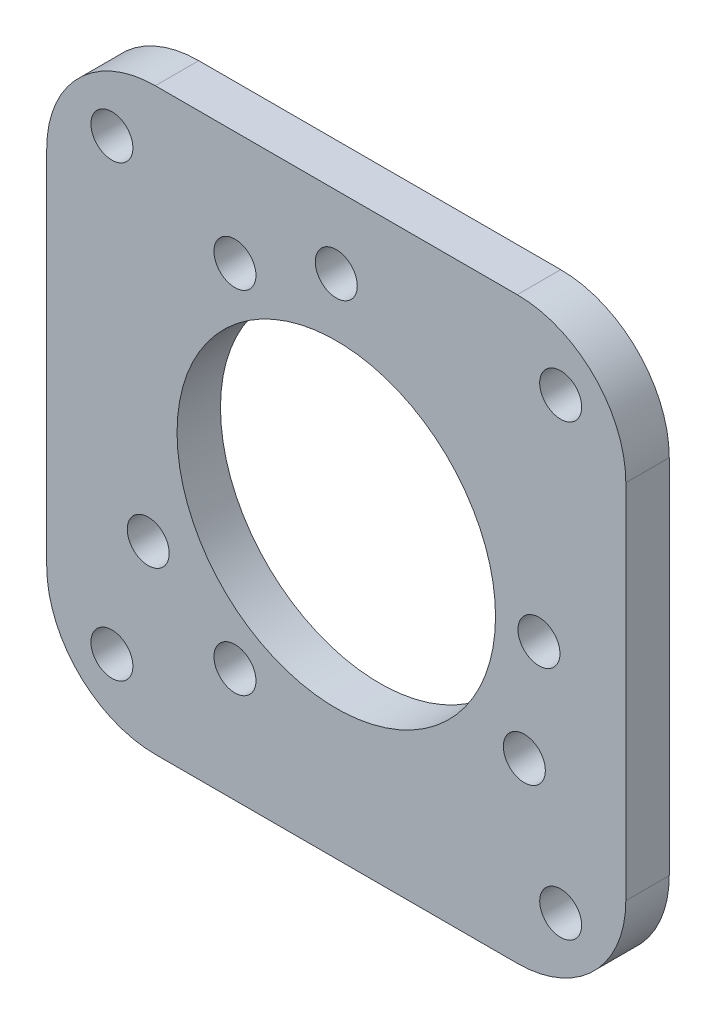
ISO-10303-21;
HEADER;
FILE_DESCRIPTION(('STEP AP214'),'2;1');
FILE_NAME('part.step','',(''),(''),'','','');
FILE_SCHEMA(('AUTOMOTIVE_DESIGN { 1 0 10303 214 1 1 1 1 }'));
ENDSEC;
DATA;
#1=APPLICATION_CONTEXT('core data for automotive mechanical design processes');
#2=APPLICATION_PROTOCOL_DEFINITION('international standard','automotive_design',2000,#1);
#3=PRODUCT_CONTEXT('',#1,'mechanical');
#4=PRODUCT('Part','Part','',(#3));
#5=PRODUCT_RELATED_PRODUCT_CATEGORY('part','',(#4));
#6=PRODUCT_DEFINITION_FORMATION('','',#4);
#7=PRODUCT_DEFINITION_CONTEXT('part definition',#1,'design');
#8=PRODUCT_DEFINITION('design','',#6,#7);
#9=PRODUCT_DEFINITION_SHAPE('','',#8);
#10=(LENGTH_UNIT() NAMED_UNIT(*) SI_UNIT(.MILLI.,.METRE.));
#11=(NAMED_UNIT(*) PLANE_ANGLE_UNIT() SI_UNIT($,.RADIAN.));
#12=(NAMED_UNIT(*) SI_UNIT($,.STERADIAN.) SOLID_ANGLE_UNIT());
#13=UNCERTAINTY_MEASURE_WITH_UNIT(LENGTH_MEASURE(1.E-05),#10,'distance_accuracy_value','');
#14=(GEOMETRIC_REPRESENTATION_CONTEXT(3) GLOBAL_UNCERTAINTY_ASSIGNED_CONTEXT((#13)) GLOBAL_UNIT_ASSIGNED_CONTEXT((#10,
#11,#12)) REPRESENTATION_CONTEXT('',''));
#15=CARTESIAN_POINT('',(0.,0.,0.));
#16=DIRECTION('',(0.,0.,1.));
#17=DIRECTION('',(1.,0.,0.));
#18=AXIS2_PLACEMENT_3D('',#15,#16,#17);
#19=CARTESIAN_POINT('',(12.5,12.5,3.));
#20=DIRECTION('',(0.,0.,-1.));
#21=DIRECTION('',(-1.,0.,0.));
#22=AXIS2_PLACEMENT_3D('',#19,#20,#21);
#23=CYLINDRICAL_SURFACE('',#22,7.49999999999999);
#24=CARTESIAN_POINT('',(12.5,12.5,0.));
#25=DIRECTION('',(0.,0.,1.));
#26=DIRECTION('',(1.,0.,0.));
#27=AXIS2_PLACEMENT_3D('',#24,#25,#26);
#28=CIRCLE('',#27,7.49999999999999);
#29=CARTESIAN_POINT('',(20.,12.5,0.));
#30=VERTEX_POINT('',#29);
#31=CARTESIAN_POINT('',(12.4999999967872,20.,0.));
#32=VERTEX_POINT('',#31);
#33=EDGE_CURVE('E130',#30,#32,#28,.T.);
#34=ORIENTED_EDGE('',*,*,#33,.T.);
#35=DIRECTION('',(0.,0.,-1.));
#36=VECTOR('',#35,1.);
#37=CARTESIAN_POINT('',(12.4999999967872,20.,3.));
#38=LINE('',#37,#36);
#39=CARTESIAN_POINT('',(12.4999999967872,20.,3.));
#40=VERTEX_POINT('',#39);
#41=EDGE_CURVE('E11',#40,#32,#38,.T.);
#42=ORIENTED_EDGE('',*,*,#41,.F.);
#43=CARTESIAN_POINT('',(12.5,12.5,3.));
#44=DIRECTION('',(0.,0.,1.));
#45=DIRECTION('',(1.,0.,0.));
#46=AXIS2_PLACEMENT_3D('',#43,#44,#45);
#47=CIRCLE('',#46,7.49999999999999);
#48=CARTESIAN_POINT('',(20.,12.5,3.));
#49=VERTEX_POINT('',#48);
#50=EDGE_CURVE('E145',#49,#40,#47,.T.);
#51=ORIENTED_EDGE('',*,*,#50,.F.);
#52=DIRECTION('',(0.,0.,-1.));
#53=VECTOR('',#52,1.);
#54=CARTESIAN_POINT('',(20.,12.5,3.));
#55=LINE('',#54,#53);
#56=EDGE_CURVE('E126',#49,#30,#55,.T.);
#57=ORIENTED_EDGE('',*,*,#56,.T.);
#58=EDGE_LOOP('',(#34,#42,#51,#57));
#59=FACE_BOUND('',#58,.T.);
#60=ADVANCED_FACE('F34',(#59),#23,.T.);
#61=CARTESIAN_POINT('',(-12.5000013839522,20.,3.));
#62=DIRECTION('',(0.,-1.,0.));
#63=DIRECTION('',(0.,0.,-1.));
#64=AXIS2_PLACEMENT_3D('',#61,#62,#63);
#65=PLANE('',#64);
#66=DIRECTION('',(-1.,0.,0.));
#67=VECTOR('',#66,1.);
#68=CARTESIAN_POINT('',(-12.5000013839522,20.,0.));
#69=LINE('',#68,#67);
#70=CARTESIAN_POINT('',(-12.5000013839522,20.,0.));
#71=VERTEX_POINT('',#70);
#72=EDGE_CURVE('E133',#32,#71,#69,.T.);
#73=ORIENTED_EDGE('',*,*,#72,.T.);
#74=DIRECTION('',(0.,0.,-1.));
#75=VECTOR('',#74,1.);
#76=CARTESIAN_POINT('',(-12.5000013839522,20.,3.));
#77=LINE('',#76,#75);
#78=CARTESIAN_POINT('',(-12.5000013839522,20.,3.));
#79=VERTEX_POINT('',#78);
#80=EDGE_CURVE('E42',#79,#71,#77,.T.);
#81=ORIENTED_EDGE('',*,*,#80,.F.);
#82=DIRECTION('',(-1.,0.,0.));
#83=VECTOR('',#82,1.);
#84=CARTESIAN_POINT('',(-12.5000013839522,20.,3.));
#85=LINE('',#84,#83);
#86=EDGE_CURVE('E93',#40,#79,#85,.T.);
#87=ORIENTED_EDGE('',*,*,#86,.F.);
#88=ORIENTED_EDGE('',*,*,#41,.T.);
#89=EDGE_LOOP('',(#73,#81,#87,#88));
#90=FACE_BOUND('',#89,.T.);
#91=ADVANCED_FACE('F264',(#90),#65,.F.);
#92=CARTESIAN_POINT('',(-12.5,12.5,3.));
#93=DIRECTION('',(0.,0.,-1.));
#94=DIRECTION('',(-1.,0.,0.));
#95=AXIS2_PLACEMENT_3D('',#92,#93,#94);
#96=CYLINDRICAL_SURFACE('',#95,7.50000000000006);
#97=CARTESIAN_POINT('',(-12.5,12.5,0.));
#98=DIRECTION('',(0.,0.,1.));
#99=DIRECTION('',(1.,0.,0.));
#100=AXIS2_PLACEMENT_3D('',#97,#98,#99);
#101=CIRCLE('',#100,7.50000000000006);
#102=CARTESIAN_POINT('',(-20.0000000000001,12.5,0.));
#103=VERTEX_POINT('',#102);
#104=EDGE_CURVE('E136',#71,#103,#101,.T.);
#105=ORIENTED_EDGE('',*,*,#104,.T.);
#106=DIRECTION('',(0.,0.,-1.));
#107=VECTOR('',#106,1.);
#108=CARTESIAN_POINT('',(-20.0000000000001,12.5,3.));
#109=LINE('',#108,#107);
#110=CARTESIAN_POINT('',(-20.0000000000001,12.5,3.));
#111=VERTEX_POINT('',#110);
#112=EDGE_CURVE('E152',#111,#103,#109,.T.);
#113=ORIENTED_EDGE('',*,*,#112,.F.);
#114=CARTESIAN_POINT('',(-12.5,12.5,3.));
#115=DIRECTION('',(0.,0.,1.));
#116=DIRECTION('',(1.,0.,0.));
#117=AXIS2_PLACEMENT_3D('',#114,#115,#116);
#118=CIRCLE('',#117,7.50000000000006);
#119=EDGE_CURVE('E160',#79,#111,#118,.T.);
#120=ORIENTED_EDGE('',*,*,#119,.F.);
#121=ORIENTED_EDGE('',*,*,#80,.T.);
#122=EDGE_LOOP('',(#105,#113,#120,#121));
#123=FACE_BOUND('',#122,.T.);
#124=ADVANCED_FACE('F158',(#123),#96,.T.);
#125=CARTESIAN_POINT('',(-20.,12.5,3.));
#126=DIRECTION('',(1.,0.,0.));
#127=DIRECTION('',(0.,0.,-1.));
#128=AXIS2_PLACEMENT_3D('',#125,#126,#127);
#129=PLANE('',#128);
#130=DIRECTION('',(0.,-1.,0.));
#131=VECTOR('',#130,1.);
#132=CARTESIAN_POINT('',(-20.,12.5,0.));
#133=LINE('',#132,#131);
#134=CARTESIAN_POINT('',(-20.,-12.5000006178472,0.));
#135=VERTEX_POINT('',#134);
#136=EDGE_CURVE('E138',#103,#135,#133,.T.);
#137=ORIENTED_EDGE('',*,*,#136,.T.);
#138=DIRECTION('',(0.,0.,-1.));
#139=VECTOR('',#138,1.);
#140=CARTESIAN_POINT('',(-20.,-12.5000006178472,3.));
#141=LINE('',#140,#139);
#142=CARTESIAN_POINT('',(-20.,-12.5000006178472,3.));
#143=VERTEX_POINT('',#142);
#144=EDGE_CURVE('E149',#143,#135,#141,.T.);
#145=ORIENTED_EDGE('',*,*,#144,.F.);
#146=DIRECTION('',(0.,-1.,0.));
#147=VECTOR('',#146,1.);
#148=CARTESIAN_POINT('',(-20.,12.5,3.));
#149=LINE('',#148,#147);
#150=EDGE_CURVE('E172',#111,#143,#149,.T.);
#151=ORIENTED_EDGE('',*,*,#150,.F.);
#152=ORIENTED_EDGE('',*,*,#112,.T.);
#153=EDGE_LOOP('',(#137,#145,#151,#152));
#154=FACE_BOUND('',#153,.T.);
#155=ADVANCED_FACE('F168',(#154),#129,.F.);
#156=CARTESIAN_POINT('',(-12.5,-12.5,3.));
#157=DIRECTION('',(0.,0.,-1.));
#158=DIRECTION('',(-1.,0.,0.));
#159=AXIS2_PLACEMENT_3D('',#156,#157,#158);
#160=CYLINDRICAL_SURFACE('',#159,7.50000000000002);
#161=CARTESIAN_POINT('',(-12.5,-12.5,0.));
#162=DIRECTION('',(0.,0.,1.));
#163=DIRECTION('',(1.,0.,0.));
#164=AXIS2_PLACEMENT_3D('',#161,#162,#163);
#165=CIRCLE('',#164,7.50000000000002);
#166=CARTESIAN_POINT('',(-12.5,-20.,0.));
#167=VERTEX_POINT('',#166);
#168=EDGE_CURVE('E140',#135,#167,#165,.T.);
#169=ORIENTED_EDGE('',*,*,#168,.T.);
#170=DIRECTION('',(0.,0.,-1.));
#171=VECTOR('',#170,1.);
#172=CARTESIAN_POINT('',(-12.5,-20.,3.));
#173=LINE('',#172,#171);
#174=CARTESIAN_POINT('',(-12.5,-20.,3.));
#175=VERTEX_POINT('',#174);
#176=EDGE_CURVE('E121',#175,#167,#173,.T.);
#177=ORIENTED_EDGE('',*,*,#176,.F.);
#178=CARTESIAN_POINT('',(-12.5,-12.5,3.));
#179=DIRECTION('',(0.,0.,1.));
#180=DIRECTION('',(1.,0.,0.));
#181=AXIS2_PLACEMENT_3D('',#178,#179,#180);
#182=CIRCLE('',#181,7.50000000000002);
#183=EDGE_CURVE('E112',#143,#175,#182,.T.);
#184=ORIENTED_EDGE('',*,*,#183,.F.);
#185=ORIENTED_EDGE('',*,*,#144,.T.);
#186=EDGE_LOOP('',(#169,#177,#184,#185));
#187=FACE_BOUND('',#186,.T.);
#188=ADVANCED_FACE('F171',(#187),#160,.T.);
#189=CARTESIAN_POINT('',(-12.5,-20.,3.));
#190=DIRECTION('',(0.,1.,0.));
#191=DIRECTION('',(-1.,0.,0.));
#192=AXIS2_PLACEMENT_3D('',#189,#190,#191);
#193=PLANE('',#192);
#194=DIRECTION('',(1.,0.,0.));
#195=VECTOR('',#194,1.);
#196=CARTESIAN_POINT('',(-12.5,-20.,0.));
#197=LINE('',#196,#195);
#198=CARTESIAN_POINT('',(12.5,-20.,0.));
#199=VERTEX_POINT('',#198);
#200=EDGE_CURVE('E120',#167,#199,#197,.T.);
#201=ORIENTED_EDGE('',*,*,#200,.T.);
#202=DIRECTION('',(0.,0.,-1.));
#203=VECTOR('',#202,1.);
#204=CARTESIAN_POINT('',(12.5,-20.,3.));
#205=LINE('',#204,#203);
#206=CARTESIAN_POINT('',(12.5,-20.,3.));
#207=VERTEX_POINT('',#206);
#208=EDGE_CURVE('E117',#207,#199,#205,.T.);
#209=ORIENTED_EDGE('',*,*,#208,.F.);
#210=DIRECTION('',(1.,0.,0.));
#211=VECTOR('',#210,1.);
#212=CARTESIAN_POINT('',(-12.5,-20.,3.));
#213=LINE('',#212,#211);
#214=EDGE_CURVE('E106',#175,#207,#213,.T.);
#215=ORIENTED_EDGE('',*,*,#214,.F.);
#216=ORIENTED_EDGE('',*,*,#176,.T.);
#217=EDGE_LOOP('',(#201,#209,#215,#216));
#218=FACE_BOUND('',#217,.T.);
#219=ADVANCED_FACE('F118',(#218),#193,.F.);
#220=CARTESIAN_POINT('',(12.5,-12.5,3.));
#221=DIRECTION('',(0.,0.,-1.));
#222=DIRECTION('',(-1.,0.,0.));
#223=AXIS2_PLACEMENT_3D('',#220,#221,#222);
#224=CYLINDRICAL_SURFACE('',#223,7.49999999999999);
#225=CARTESIAN_POINT('',(12.5,-12.5,0.));
#226=DIRECTION('',(0.,0.,1.));
#227=DIRECTION('',(1.,0.,0.));
#228=AXIS2_PLACEMENT_3D('',#225,#226,#227);
#229=CIRCLE('',#228,7.49999999999999);
#230=CARTESIAN_POINT('',(20.,-12.5,0.));
#231=VERTEX_POINT('',#230);
#232=EDGE_CURVE('E79',#199,#231,#229,.T.);
#233=ORIENTED_EDGE('',*,*,#232,.T.);
#234=DIRECTION('',(0.,0.,-1.));
#235=VECTOR('',#234,1.);
#236=CARTESIAN_POINT('',(20.,-12.5,3.));
#237=LINE('',#236,#235);
#238=CARTESIAN_POINT('',(20.,-12.5,3.));
#239=VERTEX_POINT('',#238);
#240=EDGE_CURVE('E122',#239,#231,#237,.T.);
#241=ORIENTED_EDGE('',*,*,#240,.F.);
#242=CARTESIAN_POINT('',(12.5,-12.5,3.));
#243=DIRECTION('',(0.,0.,1.));
#244=DIRECTION('',(1.,0.,0.));
#245=AXIS2_PLACEMENT_3D('',#242,#243,#244);
#246=CIRCLE('',#245,7.49999999999999);
#247=EDGE_CURVE('E110',#207,#239,#246,.T.);
#248=ORIENTED_EDGE('',*,*,#247,.F.);
#249=ORIENTED_EDGE('',*,*,#208,.T.);
#250=EDGE_LOOP('',(#233,#241,#248,#249));
#251=FACE_BOUND('',#250,.T.);
#252=ADVANCED_FACE('F124',(#251),#224,.T.);
#253=CARTESIAN_POINT('',(20.,12.5,3.));
#254=DIRECTION('',(-1.,0.,0.));
#255=DIRECTION('',(0.,0.,1.));
#256=AXIS2_PLACEMENT_3D('',#253,#254,#255);
#257=PLANE('',#256);
#258=DIRECTION('',(0.,1.,0.));
#259=VECTOR('',#258,1.);
#260=CARTESIAN_POINT('',(20.,12.5,0.));
#261=LINE('',#260,#259);
#262=EDGE_CURVE('E85',#231,#30,#261,.T.);
#263=ORIENTED_EDGE('',*,*,#262,.T.);
#264=ORIENTED_EDGE('',*,*,#56,.F.);
#265=DIRECTION('',(0.,1.,0.));
#266=VECTOR('',#265,1.);
#267=CARTESIAN_POINT('',(20.,12.5,3.));
#268=LINE('',#267,#266);
#269=EDGE_CURVE('E50',#239,#49,#268,.T.);
#270=ORIENTED_EDGE('',*,*,#269,.F.);
#271=ORIENTED_EDGE('',*,*,#240,.T.);
#272=EDGE_LOOP('',(#263,#264,#270,#271));
#273=FACE_BOUND('',#272,.T.);
#274=ADVANCED_FACE('F271',(#273),#257,.F.);
#275=CARTESIAN_POINT('',(12.5,12.5,3.));
#276=DIRECTION('',(0.,0.,1.));
#277=DIRECTION('',(1.,0.,0.));
#278=AXIS2_PLACEMENT_3D('',#275,#276,#277);
#279=PLANE('',#278);
#280=CARTESIAN_POINT('',(-7.00000000000001,-12.1243556529821,3.));
#281=DIRECTION('',(0.,0.,1.));
#282=DIRECTION('',(1.,0.,0.));
#283=AXIS2_PLACEMENT_3D('',#280,#281,#282);
#284=CIRCLE('',#283,1.45);
#285=CARTESIAN_POINT('',(-5.55000000000001,-12.1243556529821,3.));
#286=VERTEX_POINT('',#285);
#287=EDGE_CURVE('E183',#286,#286,#284,.F.);
#288=ORIENTED_EDGE('',*,*,#287,.T.);
#289=EDGE_LOOP('',(#288));
#290=FACE_BOUND('',#289,.T.);
#291=CARTESIAN_POINT('',(12.9903810567666,-7.50000000000001,3.));
#292=DIRECTION('',(0.,0.,1.));
#293=DIRECTION('',(1.,0.,0.));
#294=AXIS2_PLACEMENT_3D('',#291,#292,#293);
#295=CIRCLE('',#294,1.45);
#296=CARTESIAN_POINT('',(14.4403810567666,-7.50000000000001,3.));
#297=VERTEX_POINT('',#296);
#298=EDGE_CURVE('E186',#297,#297,#295,.F.);
#299=ORIENTED_EDGE('',*,*,#298,.T.);
#300=EDGE_LOOP('',(#299));
#301=FACE_BOUND('',#300,.T.);
#302=CARTESIAN_POINT('',(0.,0.,3.));
#303=DIRECTION('',(0.,0.,1.));
#304=DIRECTION('',(1.,0.,0.));
#305=AXIS2_PLACEMENT_3D('',#302,#303,#304);
#306=CIRCLE('',#305,11.);
#307=CARTESIAN_POINT('',(11.,0.,3.));
#308=VERTEX_POINT('',#307);
#309=EDGE_CURVE('E189',#308,#308,#306,.F.);
#310=ORIENTED_EDGE('',*,*,#309,.T.);
#311=EDGE_LOOP('',(#310));
#312=FACE_BOUND('',#311,.T.);
#313=CARTESIAN_POINT('',(-12.9903810567666,-7.49999999999992,3.));
#314=DIRECTION('',(0.,0.,1.));
#315=DIRECTION('',(1.,0.,0.));
#316=AXIS2_PLACEMENT_3D('',#313,#314,#315);
#317=CIRCLE('',#316,1.45);
#318=CARTESIAN_POINT('',(-11.5403810567666,-7.49999999999992,3.));
#319=VERTEX_POINT('',#318);
#320=EDGE_CURVE('E192',#319,#319,#317,.F.);
#321=ORIENTED_EDGE('',*,*,#320,.T.);
#322=EDGE_LOOP('',(#321));
#323=FACE_BOUND('',#322,.T.);
#324=CARTESIAN_POINT('',(-7.00000000000002,12.1243556529821,3.));
#325=DIRECTION('',(0.,0.,1.));
#326=DIRECTION('',(1.,0.,0.));
#327=AXIS2_PLACEMENT_3D('',#324,#325,#326);
#328=CIRCLE('',#327,1.45);
#329=CARTESIAN_POINT('',(-5.55000000000002,12.1243556529821,3.));
#330=VERTEX_POINT('',#329);
#331=EDGE_CURVE('E195',#330,#330,#328,.F.);
#332=ORIENTED_EDGE('',*,*,#331,.T.);
#333=EDGE_LOOP('',(#332));
#334=FACE_BOUND('',#333,.T.);
#335=CARTESIAN_POINT('',(-15.5,15.5,3.));
#336=DIRECTION('',(0.,0.,1.));
#337=DIRECTION('',(1.,0.,0.));
#338=AXIS2_PLACEMENT_3D('',#335,#336,#337);
#339=CIRCLE('',#338,1.45);
#340=CARTESIAN_POINT('',(-14.05,15.5,3.));
#341=VERTEX_POINT('',#340);
#342=EDGE_CURVE('E198',#341,#341,#339,.F.);
#343=ORIENTED_EDGE('',*,*,#342,.T.);
#344=EDGE_LOOP('',(#343));
#345=FACE_BOUND('',#344,.T.);
#346=CARTESIAN_POINT('',(15.5,-15.5,3.));
#347=DIRECTION('',(0.,0.,1.));
#348=DIRECTION('',(1.,0.,0.));
#349=AXIS2_PLACEMENT_3D('',#346,#347,#348);
#350=CIRCLE('',#349,1.45);
#351=CARTESIAN_POINT('',(16.95,-15.5,3.));
#352=VERTEX_POINT('',#351);
#353=EDGE_CURVE('E201',#352,#352,#350,.F.);
#354=ORIENTED_EDGE('',*,*,#353,.T.);
#355=EDGE_LOOP('',(#354));
#356=FACE_BOUND('',#355,.T.);
#357=CARTESIAN_POINT('',(-15.5,-15.5,3.));
#358=DIRECTION('',(0.,0.,1.));
#359=DIRECTION('',(1.,0.,0.));
#360=AXIS2_PLACEMENT_3D('',#357,#358,#359);
#361=CIRCLE('',#360,1.45);
#362=CARTESIAN_POINT('',(-14.05,-15.5,3.));
#363=VERTEX_POINT('',#362);
#364=EDGE_CURVE('E204',#363,#363,#361,.F.);
#365=ORIENTED_EDGE('',*,*,#364,.T.);
#366=EDGE_LOOP('',(#365));
#367=FACE_BOUND('',#366,.T.);
#368=CARTESIAN_POINT('',(0.,15.,3.));
#369=DIRECTION('',(0.,0.,1.));
#370=DIRECTION('',(1.,0.,0.));
#371=AXIS2_PLACEMENT_3D('',#368,#369,#370);
#372=CIRCLE('',#371,1.45);
#373=CARTESIAN_POINT('',(1.45,15.,3.));
#374=VERTEX_POINT('',#373);
#375=EDGE_CURVE('E207',#374,#374,#372,.F.);
#376=ORIENTED_EDGE('',*,*,#375,.T.);
#377=EDGE_LOOP('',(#376));
#378=FACE_BOUND('',#377,.T.);
#379=CARTESIAN_POINT('',(14.,0.,3.));
#380=DIRECTION('',(0.,0.,1.));
#381=DIRECTION('',(1.,0.,0.));
#382=AXIS2_PLACEMENT_3D('',#379,#380,#381);
#383=CIRCLE('',#382,1.45);
#384=CARTESIAN_POINT('',(15.45,0.,3.));
#385=VERTEX_POINT('',#384);
#386=EDGE_CURVE('E210',#385,#385,#383,.F.);
#387=ORIENTED_EDGE('',*,*,#386,.T.);
#388=EDGE_LOOP('',(#387));
#389=FACE_BOUND('',#388,.T.);
#390=CARTESIAN_POINT('',(15.5,15.5,3.));
#391=DIRECTION('',(0.,0.,1.));
#392=DIRECTION('',(1.,0.,0.));
#393=AXIS2_PLACEMENT_3D('',#390,#391,#392);
#394=CIRCLE('',#393,1.45);
#395=CARTESIAN_POINT('',(16.95,15.5,3.));
#396=VERTEX_POINT('',#395);
#397=EDGE_CURVE('E134',#396,#396,#394,.F.);
#398=ORIENTED_EDGE('',*,*,#397,.T.);
#399=EDGE_LOOP('',(#398));
#400=FACE_BOUND('',#399,.T.);
#401=ORIENTED_EDGE('',*,*,#50,.T.);
#402=ORIENTED_EDGE('',*,*,#86,.T.);
#403=ORIENTED_EDGE('',*,*,#119,.T.);
#404=ORIENTED_EDGE('',*,*,#150,.T.);
#405=ORIENTED_EDGE('',*,*,#183,.T.);
#406=ORIENTED_EDGE('',*,*,#214,.T.);
#407=ORIENTED_EDGE('',*,*,#247,.T.);
#408=ORIENTED_EDGE('',*,*,#269,.T.);
#409=EDGE_LOOP('',(#401,#402,#403,#404,#405,#406,#407,#408));
#410=FACE_BOUND('',#409,.T.);
#411=ADVANCED_FACE('F108',(#290,#301,#312,#323,#334,#345,#356,#367,#378,#389,#400,#410),#279,.T.);
#412=CARTESIAN_POINT('',(12.5,12.5,0.));
#413=DIRECTION('',(0.,0.,1.));
#414=DIRECTION('',(1.,0.,0.));
#415=AXIS2_PLACEMENT_3D('',#412,#413,#414);
#416=PLANE('',#415);
#417=CARTESIAN_POINT('',(-7.00000000000001,-12.1243556529821,0.));
#418=DIRECTION('',(0.,0.,1.));
#419=DIRECTION('',(1.,0.,0.));
#420=AXIS2_PLACEMENT_3D('',#417,#418,#419);
#421=CIRCLE('',#420,1.45);
#422=CARTESIAN_POINT('',(-5.55000000000001,-12.1243556529821,0.));
#423=VERTEX_POINT('',#422);
#424=EDGE_CURVE('E224',#423,#423,#421,.T.);
#425=ORIENTED_EDGE('',*,*,#424,.T.);
#426=EDGE_LOOP('',(#425));
#427=FACE_BOUND('',#426,.T.);
#428=CARTESIAN_POINT('',(12.9903810567666,-7.50000000000001,0.));
#429=DIRECTION('',(0.,0.,1.));
#430=DIRECTION('',(1.,0.,0.));
#431=AXIS2_PLACEMENT_3D('',#428,#429,#430);
#432=CIRCLE('',#431,1.45);
#433=CARTESIAN_POINT('',(14.4403810567666,-7.50000000000001,0.));
#434=VERTEX_POINT('',#433);
#435=EDGE_CURVE('E229',#434,#434,#432,.T.);
#436=ORIENTED_EDGE('',*,*,#435,.T.);
#437=EDGE_LOOP('',(#436));
#438=FACE_BOUND('',#437,.T.);
#439=CARTESIAN_POINT('',(0.,0.,0.));
#440=DIRECTION('',(0.,0.,1.));
#441=DIRECTION('',(1.,0.,0.));
#442=AXIS2_PLACEMENT_3D('',#439,#440,#441);
#443=CIRCLE('',#442,11.);
#444=CARTESIAN_POINT('',(11.,0.,0.));
#445=VERTEX_POINT('',#444);
#446=EDGE_CURVE('E238',#445,#445,#443,.T.);
#447=ORIENTED_EDGE('',*,*,#446,.T.);
#448=EDGE_LOOP('',(#447));
#449=FACE_BOUND('',#448,.T.);
#450=CARTESIAN_POINT('',(-12.9903810567666,-7.49999999999992,0.));
#451=DIRECTION('',(0.,0.,1.));
#452=DIRECTION('',(1.,0.,0.));
#453=AXIS2_PLACEMENT_3D('',#450,#451,#452);
#454=CIRCLE('',#453,1.45);
#455=CARTESIAN_POINT('',(-11.5403810567666,-7.49999999999992,0.));
#456=VERTEX_POINT('',#455);
#457=EDGE_CURVE('E237',#456,#456,#454,.T.);
#458=ORIENTED_EDGE('',*,*,#457,.T.);
#459=EDGE_LOOP('',(#458));
#460=FACE_BOUND('',#459,.T.);
#461=CARTESIAN_POINT('',(-7.00000000000002,12.1243556529821,0.));
#462=DIRECTION('',(0.,0.,1.));
#463=DIRECTION('',(1.,0.,0.));
#464=AXIS2_PLACEMENT_3D('',#461,#462,#463);
#465=CIRCLE('',#464,1.45);
#466=CARTESIAN_POINT('',(-5.55000000000002,12.1243556529821,0.));
#467=VERTEX_POINT('',#466);
#468=EDGE_CURVE('E232',#467,#467,#465,.T.);
#469=ORIENTED_EDGE('',*,*,#468,.T.);
#470=EDGE_LOOP('',(#469));
#471=FACE_BOUND('',#470,.T.);
#472=CARTESIAN_POINT('',(-15.5,15.5,0.));
#473=DIRECTION('',(0.,0.,1.));
#474=DIRECTION('',(-1.,0.,0.));
#475=AXIS2_PLACEMENT_3D('',#472,#473,#474);
#476=CIRCLE('',#475,1.45);
#477=CARTESIAN_POINT('',(-16.95,15.5,0.));
#478=VERTEX_POINT('',#477);
#479=EDGE_CURVE('E213',#478,#478,#476,.T.);
#480=ORIENTED_EDGE('',*,*,#479,.T.);
#481=EDGE_LOOP('',(#480));
#482=FACE_BOUND('',#481,.T.);
#483=CARTESIAN_POINT('',(15.5,-15.5,0.));
#484=DIRECTION('',(0.,0.,1.));
#485=DIRECTION('',(-1.,0.,0.));
#486=AXIS2_PLACEMENT_3D('',#483,#484,#485);
#487=CIRCLE('',#486,1.45);
#488=CARTESIAN_POINT('',(14.05,-15.5,0.));
#489=VERTEX_POINT('',#488);
#490=EDGE_CURVE('E214',#489,#489,#487,.T.);
#491=ORIENTED_EDGE('',*,*,#490,.T.);
#492=EDGE_LOOP('',(#491));
#493=FACE_BOUND('',#492,.T.);
#494=CARTESIAN_POINT('',(-15.5,-15.5,0.));
#495=DIRECTION('',(0.,0.,1.));
#496=DIRECTION('',(1.,0.,0.));
#497=AXIS2_PLACEMENT_3D('',#494,#495,#496);
#498=CIRCLE('',#497,1.45);
#499=CARTESIAN_POINT('',(-14.05,-15.5,0.));
#500=VERTEX_POINT('',#499);
#501=EDGE_CURVE('E217',#500,#500,#498,.T.);
#502=ORIENTED_EDGE('',*,*,#501,.T.);
#503=EDGE_LOOP('',(#502));
#504=FACE_BOUND('',#503,.T.);
#505=CARTESIAN_POINT('',(0.,15.,0.));
#506=DIRECTION('',(0.,0.,1.));
#507=DIRECTION('',(1.,0.,0.));
#508=AXIS2_PLACEMENT_3D('',#505,#506,#507);
#509=CIRCLE('',#508,1.45);
#510=CARTESIAN_POINT('',(1.45,15.,0.));
#511=VERTEX_POINT('',#510);
#512=EDGE_CURVE('E223',#511,#511,#509,.T.);
#513=ORIENTED_EDGE('',*,*,#512,.T.);
#514=EDGE_LOOP('',(#513));
#515=FACE_BOUND('',#514,.T.);
#516=CARTESIAN_POINT('',(14.,0.,0.));
#517=DIRECTION('',(0.,0.,1.));
#518=DIRECTION('',(1.,0.,0.));
#519=AXIS2_PLACEMENT_3D('',#516,#517,#518);
#520=CIRCLE('',#519,1.45);
#521=CARTESIAN_POINT('',(15.45,0.,0.));
#522=VERTEX_POINT('',#521);
#523=EDGE_CURVE('E220',#522,#522,#520,.T.);
#524=ORIENTED_EDGE('',*,*,#523,.T.);
#525=EDGE_LOOP('',(#524));
#526=FACE_BOUND('',#525,.T.);
#527=CARTESIAN_POINT('',(15.5,15.5,0.));
#528=DIRECTION('',(0.,0.,1.));
#529=DIRECTION('',(1.,0.,0.));
#530=AXIS2_PLACEMENT_3D('',#527,#528,#529);
#531=CIRCLE('',#530,1.45);
#532=CARTESIAN_POINT('',(16.95,15.5,0.));
#533=VERTEX_POINT('',#532);
#534=EDGE_CURVE('E180',#533,#533,#531,.T.);
#535=ORIENTED_EDGE('',*,*,#534,.T.);
#536=EDGE_LOOP('',(#535));
#537=FACE_BOUND('',#536,.T.);
#538=ORIENTED_EDGE('',*,*,#33,.F.);
#539=ORIENTED_EDGE('',*,*,#262,.F.);
#540=ORIENTED_EDGE('',*,*,#232,.F.);
#541=ORIENTED_EDGE('',*,*,#200,.F.);
#542=ORIENTED_EDGE('',*,*,#168,.F.);
#543=ORIENTED_EDGE('',*,*,#136,.F.);
#544=ORIENTED_EDGE('',*,*,#104,.F.);
#545=ORIENTED_EDGE('',*,*,#72,.F.);
#546=EDGE_LOOP('',(#538,#539,#540,#541,#542,#543,#544,#545));
#547=FACE_BOUND('',#546,.T.);
#548=ADVANCED_FACE('F164',(#427,#438,#449,#460,#471,#482,#493,#504,#515,#526,#537,#547),#416,.F.);
#549=CARTESIAN_POINT('',(15.5,15.5,5.));
#550=DIRECTION('',(0.,0.,-1.));
#551=DIRECTION('',(-1.,0.,0.));
#552=AXIS2_PLACEMENT_3D('',#549,#550,#551);
#553=CYLINDRICAL_SURFACE('',#552,1.45);
#554=ORIENTED_EDGE('',*,*,#397,.F.);
#555=EDGE_LOOP('',(#554));
#556=FACE_BOUND('',#555,.T.);
#557=ORIENTED_EDGE('',*,*,#534,.F.);
#558=EDGE_LOOP('',(#557));
#559=FACE_BOUND('',#558,.T.);
#560=ADVANCED_FACE('F329',(#556,#559),#553,.F.);
#561=CARTESIAN_POINT('',(14.,0.,5.));
#562=DIRECTION('',(0.,0.,-1.));
#563=DIRECTION('',(-1.,0.,0.));
#564=AXIS2_PLACEMENT_3D('',#561,#562,#563);
#565=CYLINDRICAL_SURFACE('',#564,1.45);
#566=ORIENTED_EDGE('',*,*,#386,.F.);
#567=EDGE_LOOP('',(#566));
#568=FACE_BOUND('',#567,.T.);
#569=ORIENTED_EDGE('',*,*,#523,.F.);
#570=EDGE_LOOP('',(#569));
#571=FACE_BOUND('',#570,.T.);
#572=ADVANCED_FACE('F338',(#568,#571),#565,.F.);
#573=CARTESIAN_POINT('',(0.,15.,5.));
#574=DIRECTION('',(0.,0.,-1.));
#575=DIRECTION('',(-1.,0.,0.));
#576=AXIS2_PLACEMENT_3D('',#573,#574,#575);
#577=CYLINDRICAL_SURFACE('',#576,1.45);
#578=ORIENTED_EDGE('',*,*,#375,.F.);
#579=EDGE_LOOP('',(#578));
#580=FACE_BOUND('',#579,.T.);
#581=ORIENTED_EDGE('',*,*,#512,.F.);
#582=EDGE_LOOP('',(#581));
#583=FACE_BOUND('',#582,.T.);
#584=ADVANCED_FACE('F348',(#580,#583),#577,.F.);
#585=CARTESIAN_POINT('',(-15.5,-15.5,5.));
#586=DIRECTION('',(0.,0.,-1.));
#587=DIRECTION('',(-1.,0.,0.));
#588=AXIS2_PLACEMENT_3D('',#585,#586,#587);
#589=CYLINDRICAL_SURFACE('',#588,1.45);
#590=ORIENTED_EDGE('',*,*,#364,.F.);
#591=EDGE_LOOP('',(#590));
#592=FACE_BOUND('',#591,.T.);
#593=ORIENTED_EDGE('',*,*,#501,.F.);
#594=EDGE_LOOP('',(#593));
#595=FACE_BOUND('',#594,.T.);
#596=ADVANCED_FACE('F358',(#592,#595),#589,.F.);
#597=CARTESIAN_POINT('',(15.5,-15.5,5.));
#598=DIRECTION('',(0.,0.,-1.));
#599=DIRECTION('',(-1.,0.,0.));
#600=AXIS2_PLACEMENT_3D('',#597,#598,#599);
#601=CYLINDRICAL_SURFACE('',#600,1.45);
#602=ORIENTED_EDGE('',*,*,#353,.F.);
#603=EDGE_LOOP('',(#602));
#604=FACE_BOUND('',#603,.T.);
#605=ORIENTED_EDGE('',*,*,#490,.F.);
#606=EDGE_LOOP('',(#605));
#607=FACE_BOUND('',#606,.T.);
#608=ADVANCED_FACE('F368',(#604,#607),#601,.F.);
#609=CARTESIAN_POINT('',(-15.5,15.5,5.));
#610=DIRECTION('',(0.,0.,-1.));
#611=DIRECTION('',(-1.,0.,0.));
#612=AXIS2_PLACEMENT_3D('',#609,#610,#611);
#613=CYLINDRICAL_SURFACE('',#612,1.45);
#614=ORIENTED_EDGE('',*,*,#342,.F.);
#615=EDGE_LOOP('',(#614));
#616=FACE_BOUND('',#615,.T.);
#617=ORIENTED_EDGE('',*,*,#479,.F.);
#618=EDGE_LOOP('',(#617));
#619=FACE_BOUND('',#618,.T.);
#620=ADVANCED_FACE('F259',(#616,#619),#613,.F.);
#621=CARTESIAN_POINT('',(-7.00000000000002,12.1243556529821,5.));
#622=DIRECTION('',(0.,0.,-1.));
#623=DIRECTION('',(-1.,0.,0.));
#624=AXIS2_PLACEMENT_3D('',#621,#622,#623);
#625=CYLINDRICAL_SURFACE('',#624,1.45);
#626=ORIENTED_EDGE('',*,*,#331,.F.);
#627=EDGE_LOOP('',(#626));
#628=FACE_BOUND('',#627,.T.);
#629=ORIENTED_EDGE('',*,*,#468,.F.);
#630=EDGE_LOOP('',(#629));
#631=FACE_BOUND('',#630,.T.);
#632=ADVANCED_FACE('F249',(#628,#631),#625,.F.);
#633=CARTESIAN_POINT('',(-12.9903810567666,-7.49999999999992,5.));
#634=DIRECTION('',(0.,0.,-1.));
#635=DIRECTION('',(-1.,0.,0.));
#636=AXIS2_PLACEMENT_3D('',#633,#634,#635);
#637=CYLINDRICAL_SURFACE('',#636,1.45);
#638=ORIENTED_EDGE('',*,*,#320,.F.);
#639=EDGE_LOOP('',(#638));
#640=FACE_BOUND('',#639,.T.);
#641=ORIENTED_EDGE('',*,*,#457,.F.);
#642=EDGE_LOOP('',(#641));
#643=FACE_BOUND('',#642,.T.);
#644=ADVANCED_FACE('F246',(#640,#643),#637,.F.);
#645=CARTESIAN_POINT('',(0.,0.,5.));
#646=DIRECTION('',(0.,0.,-1.));
#647=DIRECTION('',(-1.,0.,0.));
#648=AXIS2_PLACEMENT_3D('',#645,#646,#647);
#649=CYLINDRICAL_SURFACE('',#648,11.);
#650=ORIENTED_EDGE('',*,*,#309,.F.);
#651=EDGE_LOOP('',(#650));
#652=FACE_BOUND('',#651,.T.);
#653=ORIENTED_EDGE('',*,*,#446,.F.);
#654=EDGE_LOOP('',(#653));
#655=FACE_BOUND('',#654,.T.);
#656=ADVANCED_FACE('F248',(#652,#655),#649,.F.);
#657=CARTESIAN_POINT('',(12.9903810567666,-7.50000000000001,5.));
#658=DIRECTION('',(0.,0.,-1.));
#659=DIRECTION('',(-1.,0.,0.));
#660=AXIS2_PLACEMENT_3D('',#657,#658,#659);
#661=CYLINDRICAL_SURFACE('',#660,1.45);
#662=ORIENTED_EDGE('',*,*,#298,.F.);
#663=EDGE_LOOP('',(#662));
#664=FACE_BOUND('',#663,.T.);
#665=ORIENTED_EDGE('',*,*,#435,.F.);
#666=EDGE_LOOP('',(#665));
#667=FACE_BOUND('',#666,.T.);
#668=ADVANCED_FACE('F256',(#664,#667),#661,.F.);
#669=CARTESIAN_POINT('',(-7.00000000000001,-12.1243556529821,5.));
#670=DIRECTION('',(0.,0.,-1.));
#671=DIRECTION('',(-1.,0.,0.));
#672=AXIS2_PLACEMENT_3D('',#669,#670,#671);
#673=CYLINDRICAL_SURFACE('',#672,1.45);
#674=ORIENTED_EDGE('',*,*,#287,.F.);
#675=EDGE_LOOP('',(#674));
#676=FACE_BOUND('',#675,.T.);
#677=ORIENTED_EDGE('',*,*,#424,.F.);
#678=EDGE_LOOP('',(#677));
#679=FACE_BOUND('',#678,.T.);
#680=ADVANCED_FACE('F412',(#676,#679),#673,.F.);
#681=CLOSED_SHELL('',(#60,#91,#124,#155,#188,#219,#252,#274,#411,#548,#560,#572,#584,#596,#608,
#620,#632,#644,#656,#668,#680));
#682=MANIFOLD_SOLID_BREP('B2',#681);
#683=ADVANCED_BREP_SHAPE_REPRESENTATION('',(#18,#682),#14);
#684=SHAPE_DEFINITION_REPRESENTATION(#9,#683);
ENDSEC;
END-ISO-10303-21;
